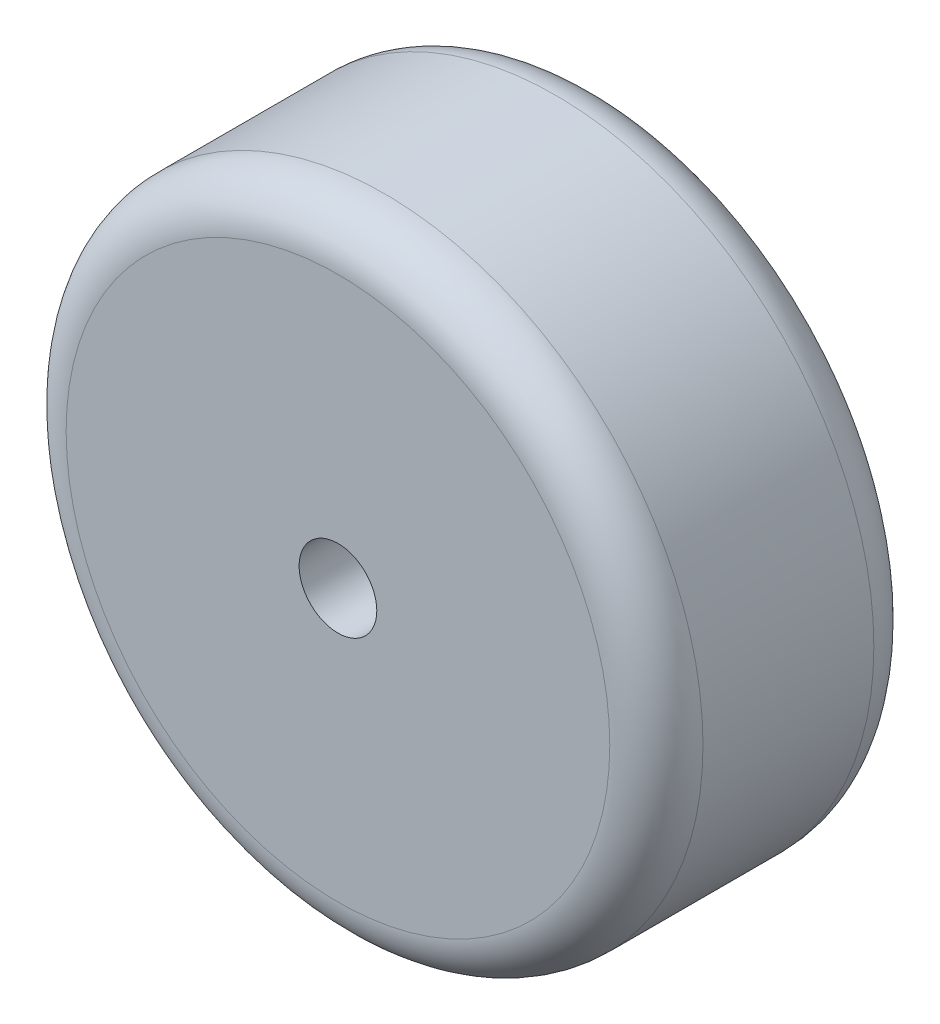
ISO-10303-21;
HEADER;
FILE_DESCRIPTION(('STEP AP214'),'2;1');
FILE_NAME('part.step','',(''),(''),'','','');
FILE_SCHEMA(('AUTOMOTIVE_DESIGN { 1 0 10303 214 1 1 1 1 }'));
ENDSEC;
DATA;
#1=APPLICATION_CONTEXT('core data for automotive mechanical design processes');
#2=APPLICATION_PROTOCOL_DEFINITION('international standard','automotive_design',2000,#1);
#3=PRODUCT_CONTEXT('',#1,'mechanical');
#4=PRODUCT('Part','Part','',(#3));
#5=PRODUCT_RELATED_PRODUCT_CATEGORY('part','',(#4));
#6=PRODUCT_DEFINITION_FORMATION('','',#4);
#7=PRODUCT_DEFINITION_CONTEXT('part definition',#1,'design');
#8=PRODUCT_DEFINITION('design','',#6,#7);
#9=PRODUCT_DEFINITION_SHAPE('','',#8);
#10=(LENGTH_UNIT() NAMED_UNIT(*) SI_UNIT(.MILLI.,.METRE.));
#11=(NAMED_UNIT(*) PLANE_ANGLE_UNIT() SI_UNIT($,.RADIAN.));
#12=(NAMED_UNIT(*) SI_UNIT($,.STERADIAN.) SOLID_ANGLE_UNIT());
#13=UNCERTAINTY_MEASURE_WITH_UNIT(LENGTH_MEASURE(1.E-05),#10,'distance_accuracy_value','');
#14=(GEOMETRIC_REPRESENTATION_CONTEXT(3) GLOBAL_UNCERTAINTY_ASSIGNED_CONTEXT((#13)) GLOBAL_UNIT_ASSIGNED_CONTEXT((#10,
#11,#12)) REPRESENTATION_CONTEXT('',''));
#15=CARTESIAN_POINT('',(0.,0.,0.));
#16=DIRECTION('',(0.,0.,1.));
#17=DIRECTION('',(1.,0.,0.));
#18=AXIS2_PLACEMENT_3D('',#15,#16,#17);
#19=CARTESIAN_POINT('',(0.,0.,17.));
#20=DIRECTION('',(0.,0.,-1.));
#21=DIRECTION('',(-1.,0.,0.));
#22=AXIS2_PLACEMENT_3D('',#19,#20,#21);
#23=CYLINDRICAL_SURFACE('',#22,20.5);
#24=CARTESIAN_POINT('',(0.,0.,3.));
#25=DIRECTION('',(0.,0.,1.));
#26=DIRECTION('',(1.,0.,0.));
#27=AXIS2_PLACEMENT_3D('',#24,#25,#26);
#28=CIRCLE('',#27,20.5);
#29=CARTESIAN_POINT('',(20.5,0.,3.));
#30=VERTEX_POINT('',#29);
#31=EDGE_CURVE('E50',#30,#30,#28,.T.);
#32=ORIENTED_EDGE('',*,*,#31,.T.);
#33=EDGE_LOOP('',(#32));
#34=FACE_BOUND('',#33,.T.);
#35=CARTESIAN_POINT('',(0.,0.,14.));
#36=DIRECTION('',(0.,0.,1.));
#37=DIRECTION('',(1.,0.,0.));
#38=AXIS2_PLACEMENT_3D('',#35,#36,#37);
#39=CIRCLE('',#38,20.5);
#40=CARTESIAN_POINT('',(20.5,0.,14.));
#41=VERTEX_POINT('',#40);
#42=EDGE_CURVE('E55',#41,#41,#39,.F.);
#43=ORIENTED_EDGE('',*,*,#42,.T.);
#44=EDGE_LOOP('',(#43));
#45=FACE_BOUND('',#44,.T.);
#46=ADVANCED_FACE('F37',(#34,#45),#23,.T.);
#47=CARTESIAN_POINT('',(0.,0.,17.));
#48=DIRECTION('',(0.,0.,1.));
#49=DIRECTION('',(1.,0.,0.));
#50=AXIS2_PLACEMENT_3D('',#47,#48,#49);
#51=PLANE('',#50);
#52=CARTESIAN_POINT('',(0.,0.,17.));
#53=DIRECTION('',(0.,0.,1.));
#54=DIRECTION('',(1.,0.,0.));
#55=AXIS2_PLACEMENT_3D('',#52,#53,#54);
#56=CIRCLE('',#55,17.5);
#57=CARTESIAN_POINT('',(17.5,0.,17.));
#58=VERTEX_POINT('',#57);
#59=EDGE_CURVE('E10',#58,#58,#56,.T.);
#60=ORIENTED_EDGE('',*,*,#59,.T.);
#61=EDGE_LOOP('',(#60));
#62=FACE_BOUND('',#61,.T.);
#63=CARTESIAN_POINT('',(0.,0.,17.));
#64=DIRECTION('',(0.,0.,1.));
#65=DIRECTION('',(1.,0.,0.));
#66=AXIS2_PLACEMENT_3D('',#63,#64,#65);
#67=CIRCLE('',#66,2.5);
#68=CARTESIAN_POINT('',(2.5,0.,17.));
#69=VERTEX_POINT('',#68);
#70=EDGE_CURVE('E62',#69,#69,#67,.T.);
#71=ORIENTED_EDGE('',*,*,#70,.F.);
#72=EDGE_LOOP('',(#71));
#73=FACE_BOUND('',#72,.T.);
#74=ADVANCED_FACE('F79',(#62,#73),#51,.T.);
#75=CARTESIAN_POINT('',(0.,0.,0.));
#76=DIRECTION('',(0.,0.,1.));
#77=DIRECTION('',(1.,0.,0.));
#78=AXIS2_PLACEMENT_3D('',#75,#76,#77);
#79=PLANE('',#78);
#80=CARTESIAN_POINT('',(0.,0.,0.));
#81=DIRECTION('',(0.,0.,1.));
#82=DIRECTION('',(1.,0.,0.));
#83=AXIS2_PLACEMENT_3D('',#80,#81,#82);
#84=CIRCLE('',#83,17.5);
#85=CARTESIAN_POINT('',(17.5,0.,0.));
#86=VERTEX_POINT('',#85);
#87=EDGE_CURVE('E45',#86,#86,#84,.F.);
#88=ORIENTED_EDGE('',*,*,#87,.T.);
#89=EDGE_LOOP('',(#88));
#90=FACE_BOUND('',#89,.T.);
#91=CARTESIAN_POINT('',(0.,0.,0.));
#92=DIRECTION('',(0.,0.,1.));
#93=DIRECTION('',(1.,0.,0.));
#94=AXIS2_PLACEMENT_3D('',#91,#92,#93);
#95=CIRCLE('',#94,2.5);
#96=CARTESIAN_POINT('',(2.5,0.,0.));
#97=VERTEX_POINT('',#96);
#98=EDGE_CURVE('E61',#97,#97,#95,.T.);
#99=ORIENTED_EDGE('',*,*,#98,.T.);
#100=EDGE_LOOP('',(#99));
#101=FACE_BOUND('',#100,.T.);
#102=ADVANCED_FACE('F70',(#90,#101),#79,.F.);
#103=CARTESIAN_POINT('',(0.,0.,0.));
#104=DIRECTION('',(0.,0.,1.));
#105=DIRECTION('',(1.,0.,0.));
#106=AXIS2_PLACEMENT_3D('',#103,#104,#105);
#107=CYLINDRICAL_SURFACE('',#106,2.5);
#108=ORIENTED_EDGE('',*,*,#98,.F.);
#109=EDGE_LOOP('',(#108));
#110=FACE_BOUND('',#109,.T.);
#111=ORIENTED_EDGE('',*,*,#70,.T.);
#112=EDGE_LOOP('',(#111));
#113=FACE_BOUND('',#112,.T.);
#114=ADVANCED_FACE('F72',(#110,#113),#107,.F.);
#115=CARTESIAN_POINT('',(0.,0.,3.));
#116=DIRECTION('',(0.,0.,1.));
#117=DIRECTION('',(1.,0.,0.));
#118=AXIS2_PLACEMENT_3D('',#115,#116,#117);
#119=TOROIDAL_SURFACE('',#118,17.5,3.);
#120=ORIENTED_EDGE('',*,*,#87,.F.);
#121=EDGE_LOOP('',(#120));
#122=FACE_BOUND('',#121,.T.);
#123=ORIENTED_EDGE('',*,*,#31,.F.);
#124=EDGE_LOOP('',(#123));
#125=FACE_BOUND('',#124,.T.);
#126=ADVANCED_FACE('F75',(#122,#125),#119,.T.);
#127=CARTESIAN_POINT('',(0.,0.,14.));
#128=DIRECTION('',(0.,0.,1.));
#129=DIRECTION('',(1.,0.,0.));
#130=AXIS2_PLACEMENT_3D('',#127,#128,#129);
#131=TOROIDAL_SURFACE('',#130,17.5,3.);
#132=ORIENTED_EDGE('',*,*,#42,.F.);
#133=EDGE_LOOP('',(#132));
#134=FACE_BOUND('',#133,.T.);
#135=ORIENTED_EDGE('',*,*,#59,.F.);
#136=EDGE_LOOP('',(#135));
#137=FACE_BOUND('',#136,.T.);
#138=ADVANCED_FACE('F39',(#134,#137),#131,.T.);
#139=CLOSED_SHELL('',(#46,#74,#102,#114,#126,#138));
#140=MANIFOLD_SOLID_BREP('B2',#139);
#141=ADVANCED_BREP_SHAPE_REPRESENTATION('',(#18,#140),#14);
#142=SHAPE_DEFINITION_REPRESENTATION(#9,#141);
ENDSEC;
END-ISO-10303-21;
